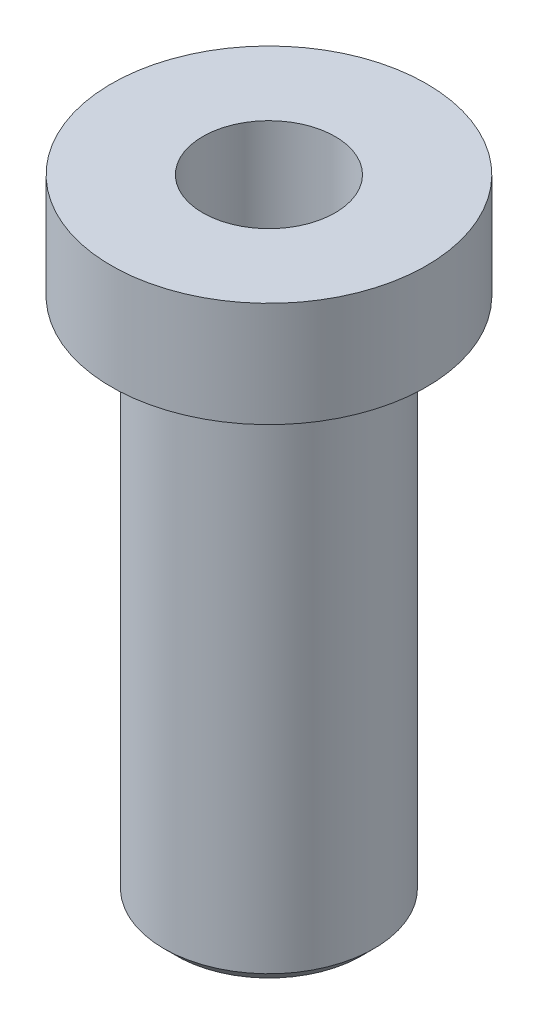
ISO-10303-21;
HEADER;
FILE_DESCRIPTION(('STEP AP214'),'2;1');
FILE_NAME('part.step','',(''),(''),'','','');
FILE_SCHEMA(('AUTOMOTIVE_DESIGN { 1 0 10303 214 1 1 1 1 }'));
ENDSEC;
DATA;
#1=APPLICATION_CONTEXT('core data for automotive mechanical design processes');
#2=APPLICATION_PROTOCOL_DEFINITION('international standard','automotive_design',2000,#1);
#3=PRODUCT_CONTEXT('',#1,'mechanical');
#4=PRODUCT('Part','Part','',(#3));
#5=PRODUCT_RELATED_PRODUCT_CATEGORY('part','',(#4));
#6=PRODUCT_DEFINITION_FORMATION('','',#4);
#7=PRODUCT_DEFINITION_CONTEXT('part definition',#1,'design');
#8=PRODUCT_DEFINITION('design','',#6,#7);
#9=PRODUCT_DEFINITION_SHAPE('','',#8);
#10=(LENGTH_UNIT() NAMED_UNIT(*) SI_UNIT(.MILLI.,.METRE.));
#11=(NAMED_UNIT(*) PLANE_ANGLE_UNIT() SI_UNIT($,.RADIAN.));
#12=(NAMED_UNIT(*) SI_UNIT($,.STERADIAN.) SOLID_ANGLE_UNIT());
#13=UNCERTAINTY_MEASURE_WITH_UNIT(LENGTH_MEASURE(1.E-05),#10,'distance_accuracy_value','');
#14=(GEOMETRIC_REPRESENTATION_CONTEXT(3) GLOBAL_UNCERTAINTY_ASSIGNED_CONTEXT((#13)) GLOBAL_UNIT_ASSIGNED_CONTEXT((#10,
#11,#12)) REPRESENTATION_CONTEXT('',''));
#15=CARTESIAN_POINT('',(0.,0.,0.));
#16=DIRECTION('',(0.,0.,1.));
#17=DIRECTION('',(1.,0.,0.));
#18=AXIS2_PLACEMENT_3D('',#15,#16,#17);
#19=CARTESIAN_POINT('',(0.5,0.,0.));
#20=DIRECTION('',(0.,-1.,0.));
#21=DIRECTION('',(0.,0.,-1.));
#22=AXIS2_PLACEMENT_3D('',#19,#20,#21);
#23=PLANE('',#22);
#24=CARTESIAN_POINT('',(0.,0.,0.));
#25=DIRECTION('',(0.,-1.,0.));
#26=DIRECTION('',(0.,0.,-1.));
#27=AXIS2_PLACEMENT_3D('',#24,#25,#26);
#28=CIRCLE('',#27,0.44);
#29=CARTESIAN_POINT('',(0.,0.,-0.44));
#30=VERTEX_POINT('',#29);
#31=EDGE_CURVE('E47',#30,#30,#28,.T.);
#32=ORIENTED_EDGE('',*,*,#31,.T.);
#33=EDGE_LOOP('',(#32));
#34=FACE_BOUND('',#33,.T.);
#35=CARTESIAN_POINT('',(0.,0.,0.));
#36=DIRECTION('',(0.,1.,0.));
#37=DIRECTION('',(0.,0.,1.));
#38=AXIS2_PLACEMENT_3D('',#35,#36,#37);
#39=CIRCLE('',#38,0.315);
#40=CARTESIAN_POINT('',(0.,0.,0.315));
#41=VERTEX_POINT('',#40);
#42=EDGE_CURVE('E67',#41,#41,#39,.T.);
#43=ORIENTED_EDGE('',*,*,#42,.T.);
#44=EDGE_LOOP('',(#43));
#45=FACE_BOUND('',#44,.T.);
#46=ADVANCED_FACE('F38',(#34,#45),#23,.T.);
#47=CARTESIAN_POINT('',(0.,3.,0.));
#48=DIRECTION('',(0.,1.,0.));
#49=DIRECTION('',(0.,0.,1.));
#50=AXIS2_PLACEMENT_3D('',#47,#48,#49);
#51=PLANE('',#50);
#52=CARTESIAN_POINT('',(0.,3.,0.));
#53=DIRECTION('',(0.,1.,0.));
#54=DIRECTION('',(0.,0.,1.));
#55=AXIS2_PLACEMENT_3D('',#52,#53,#54);
#56=CIRCLE('',#55,0.315);
#57=CARTESIAN_POINT('',(0.,3.,0.315));
#58=VERTEX_POINT('',#57);
#59=EDGE_CURVE('E68',#58,#58,#56,.T.);
#60=ORIENTED_EDGE('',*,*,#59,.F.);
#61=EDGE_LOOP('',(#60));
#62=FACE_BOUND('',#61,.T.);
#63=CARTESIAN_POINT('',(0.,3.,0.));
#64=DIRECTION('',(0.,-1.,0.));
#65=DIRECTION('',(0.,0.,-1.));
#66=AXIS2_PLACEMENT_3D('',#63,#64,#65);
#67=CIRCLE('',#66,0.75);
#68=CARTESIAN_POINT('',(0.,3.,-0.75));
#69=VERTEX_POINT('',#68);
#70=EDGE_CURVE('E52',#69,#69,#67,.T.);
#71=ORIENTED_EDGE('',*,*,#70,.F.);
#72=EDGE_LOOP('',(#71));
#73=FACE_BOUND('',#72,.T.);
#74=ADVANCED_FACE('F84',(#62,#73),#51,.T.);
#75=CARTESIAN_POINT('',(0.,0.,0.));
#76=DIRECTION('',(0.,-1.,0.));
#77=DIRECTION('',(0.,0.,-1.));
#78=AXIS2_PLACEMENT_3D('',#75,#76,#77);
#79=CYLINDRICAL_SURFACE('',#78,0.75);
#80=ORIENTED_EDGE('',*,*,#70,.T.);
#81=EDGE_LOOP('',(#80));
#82=FACE_BOUND('',#81,.T.);
#83=CARTESIAN_POINT('',(0.,2.5,0.));
#84=DIRECTION('',(0.,-1.,0.));
#85=DIRECTION('',(0.,0.,-1.));
#86=AXIS2_PLACEMENT_3D('',#83,#84,#85);
#87=CIRCLE('',#86,0.75);
#88=CARTESIAN_POINT('',(0.,2.5,-0.75));
#89=VERTEX_POINT('',#88);
#90=EDGE_CURVE('E57',#89,#89,#87,.T.);
#91=ORIENTED_EDGE('',*,*,#90,.F.);
#92=EDGE_LOOP('',(#91));
#93=FACE_BOUND('',#92,.T.);
#94=ADVANCED_FACE('F87',(#82,#93),#79,.T.);
#95=CARTESIAN_POINT('',(0.75,2.5,0.));
#96=DIRECTION('',(0.,-1.,0.));
#97=DIRECTION('',(0.,0.,-1.));
#98=AXIS2_PLACEMENT_3D('',#95,#96,#97);
#99=PLANE('',#98);
#100=ORIENTED_EDGE('',*,*,#90,.T.);
#101=EDGE_LOOP('',(#100));
#102=FACE_BOUND('',#101,.T.);
#103=CARTESIAN_POINT('',(0.,2.5,0.));
#104=DIRECTION('',(0.,-1.,0.));
#105=DIRECTION('',(0.,0.,-1.));
#106=AXIS2_PLACEMENT_3D('',#103,#104,#105);
#107=CIRCLE('',#106,0.5);
#108=CARTESIAN_POINT('',(0.,2.5,-0.5));
#109=VERTEX_POINT('',#108);
#110=EDGE_CURVE('E63',#109,#109,#107,.T.);
#111=ORIENTED_EDGE('',*,*,#110,.F.);
#112=EDGE_LOOP('',(#111));
#113=FACE_BOUND('',#112,.T.);
#114=ADVANCED_FACE('F93',(#102,#113),#99,.T.);
#115=CARTESIAN_POINT('',(0.,0.,0.));
#116=DIRECTION('',(0.,-1.,0.));
#117=DIRECTION('',(0.,0.,-1.));
#118=AXIS2_PLACEMENT_3D('',#115,#116,#117);
#119=CYLINDRICAL_SURFACE('',#118,0.5);
#120=CARTESIAN_POINT('',(0.,0.06,0.));
#121=DIRECTION('',(0.,-1.,0.));
#122=DIRECTION('',(0.,0.,-1.));
#123=AXIS2_PLACEMENT_3D('',#120,#121,#122);
#124=CIRCLE('',#123,0.5);
#125=CARTESIAN_POINT('',(0.,0.06,-0.5));
#126=VERTEX_POINT('',#125);
#127=EDGE_CURVE('E10',#126,#126,#124,.F.);
#128=ORIENTED_EDGE('',*,*,#127,.T.);
#129=EDGE_LOOP('',(#128));
#130=FACE_BOUND('',#129,.T.);
#131=ORIENTED_EDGE('',*,*,#110,.T.);
#132=EDGE_LOOP('',(#131));
#133=FACE_BOUND('',#132,.T.);
#134=ADVANCED_FACE('F80',(#130,#133),#119,.T.);
#135=CARTESIAN_POINT('',(0.,0.,0.));
#136=DIRECTION('',(0.,1.,0.));
#137=DIRECTION('',(0.,0.,1.));
#138=AXIS2_PLACEMENT_3D('',#135,#136,#137);
#139=CYLINDRICAL_SURFACE('',#138,0.315);
#140=ORIENTED_EDGE('',*,*,#42,.F.);
#141=EDGE_LOOP('',(#140));
#142=FACE_BOUND('',#141,.T.);
#143=ORIENTED_EDGE('',*,*,#59,.T.);
#144=EDGE_LOOP('',(#143));
#145=FACE_BOUND('',#144,.T.);
#146=ADVANCED_FACE('F77',(#142,#145),#139,.F.);
#147=CARTESIAN_POINT('',(0.,0.,0.));
#148=DIRECTION('',(0.,1.,0.));
#149=DIRECTION('',(0.,0.,1.));
#150=AXIS2_PLACEMENT_3D('',#147,#148,#149);
#151=CONICAL_SURFACE('',#150,0.44,0.785398163397444);
#152=ORIENTED_EDGE('',*,*,#127,.F.);
#153=EDGE_LOOP('',(#152));
#154=FACE_BOUND('',#153,.T.);
#155=ORIENTED_EDGE('',*,*,#31,.F.);
#156=EDGE_LOOP('',(#155));
#157=FACE_BOUND('',#156,.T.);
#158=ADVANCED_FACE('F41',(#154,#157),#151,.T.);
#159=CLOSED_SHELL('',(#46,#74,#94,#114,#134,#146,#158));
#160=MANIFOLD_SOLID_BREP('B2',#159);
#161=ADVANCED_BREP_SHAPE_REPRESENTATION('',(#18,#160),#14);
#162=SHAPE_DEFINITION_REPRESENTATION(#9,#161);
ENDSEC;
END-ISO-10303-21;
